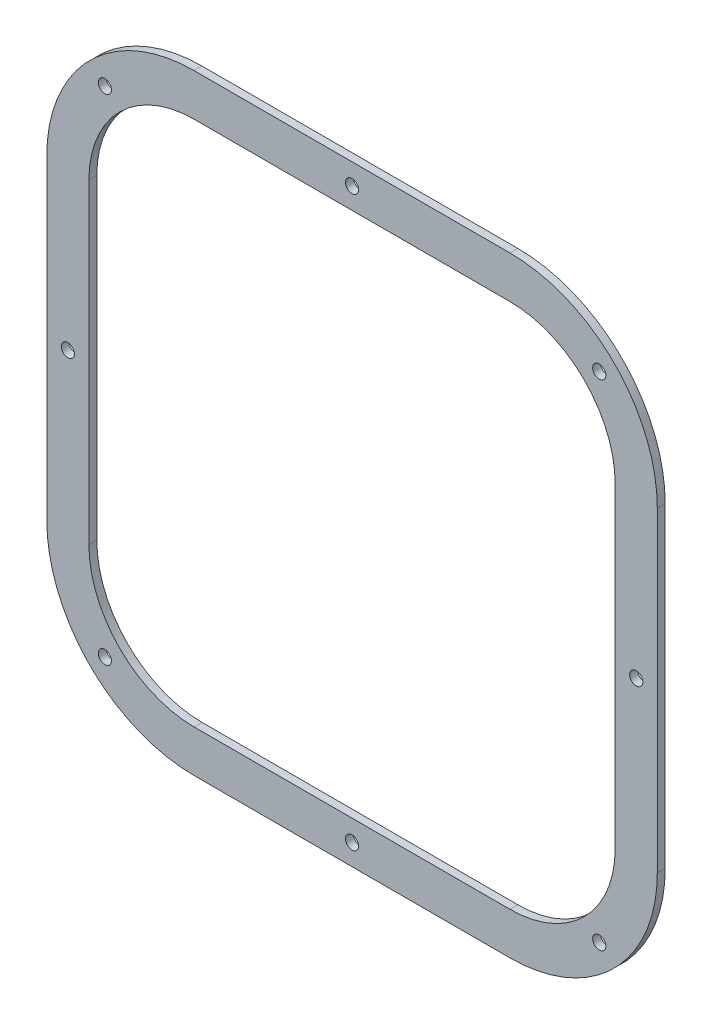
ISO-10303-21;
HEADER;
FILE_DESCRIPTION(('STEP AP214'),'2;1');
FILE_NAME('part.step','',(''),(''),'','','');
FILE_SCHEMA(('AUTOMOTIVE_DESIGN { 1 0 10303 214 1 1 1 1 }'));
ENDSEC;
DATA;
#1=APPLICATION_CONTEXT('core data for automotive mechanical design processes');
#2=APPLICATION_PROTOCOL_DEFINITION('international standard','automotive_design',2000,#1);
#3=PRODUCT_CONTEXT('',#1,'mechanical');
#4=PRODUCT('Part','Part','',(#3));
#5=PRODUCT_RELATED_PRODUCT_CATEGORY('part','',(#4));
#6=PRODUCT_DEFINITION_FORMATION('','',#4);
#7=PRODUCT_DEFINITION_CONTEXT('part definition',#1,'design');
#8=PRODUCT_DEFINITION('design','',#6,#7);
#9=PRODUCT_DEFINITION_SHAPE('','',#8);
#10=(LENGTH_UNIT() NAMED_UNIT(*) SI_UNIT(.MILLI.,.METRE.));
#11=(NAMED_UNIT(*) PLANE_ANGLE_UNIT() SI_UNIT($,.RADIAN.));
#12=(NAMED_UNIT(*) SI_UNIT($,.STERADIAN.) SOLID_ANGLE_UNIT());
#13=UNCERTAINTY_MEASURE_WITH_UNIT(LENGTH_MEASURE(1.E-05),#10,'distance_accuracy_value','');
#14=(GEOMETRIC_REPRESENTATION_CONTEXT(3) GLOBAL_UNCERTAINTY_ASSIGNED_CONTEXT((#13)) GLOBAL_UNIT_ASSIGNED_CONTEXT((#10,
#11,#12)) REPRESENTATION_CONTEXT('',''));
#15=CARTESIAN_POINT('',(0.,0.,0.));
#16=DIRECTION('',(0.,0.,1.));
#17=DIRECTION('',(1.,0.,0.));
#18=AXIS2_PLACEMENT_3D('',#15,#16,#17);
#19=CARTESIAN_POINT('',(87.9999999999999,88.,0.));
#20=DIRECTION('',(0.,0.,1.));
#21=DIRECTION('',(1.,0.,0.));
#22=AXIS2_PLACEMENT_3D('',#19,#20,#21);
#23=CYLINDRICAL_SURFACE('',#22,28.);
#24=DIRECTION('',(0.,0.,1.));
#25=VECTOR('',#24,1.);
#26=CARTESIAN_POINT('',(116.,88.,0.));
#27=LINE('',#26,#25);
#28=CARTESIAN_POINT('',(116.,88.,-1.5));
#29=VERTEX_POINT('',#28);
#30=CARTESIAN_POINT('',(116.,88.,0.));
#31=VERTEX_POINT('',#30);
#32=EDGE_CURVE('E11',#29,#31,#27,.T.);
#33=ORIENTED_EDGE('',*,*,#32,.F.);
#34=CARTESIAN_POINT('',(87.9999999999999,88.,-1.5));
#35=DIRECTION('',(0.,0.,1.));
#36=DIRECTION('',(1.,0.,0.));
#37=AXIS2_PLACEMENT_3D('',#34,#35,#36);
#38=CIRCLE('',#37,28.);
#39=CARTESIAN_POINT('',(87.9999999999997,116.,-1.5));
#40=VERTEX_POINT('',#39);
#41=EDGE_CURVE('E132',#29,#40,#38,.T.);
#42=ORIENTED_EDGE('',*,*,#41,.T.);
#43=DIRECTION('',(0.,0.,1.));
#44=VECTOR('',#43,1.);
#45=CARTESIAN_POINT('',(87.9999999999997,116.,0.));
#46=LINE('',#45,#44);
#47=CARTESIAN_POINT('',(87.9999999999997,116.,0.));
#48=VERTEX_POINT('',#47);
#49=EDGE_CURVE('E50',#40,#48,#46,.T.);
#50=ORIENTED_EDGE('',*,*,#49,.T.);
#51=CARTESIAN_POINT('',(87.9999999999999,88.,0.));
#52=DIRECTION('',(0.,0.,1.));
#53=DIRECTION('',(-1.,0.,0.));
#54=AXIS2_PLACEMENT_3D('',#51,#52,#53);
#55=CIRCLE('',#54,28.);
#56=EDGE_CURVE('E209',#31,#48,#55,.T.);
#57=ORIENTED_EDGE('',*,*,#56,.F.);
#58=EDGE_LOOP('',(#33,#42,#50,#57));
#59=FACE_BOUND('',#58,.T.);
#60=ADVANCED_FACE('F40',(#59),#23,.T.);
#61=CARTESIAN_POINT('',(28.,116.,0.));
#62=DIRECTION('',(0.,1.,0.));
#63=DIRECTION('',(-1.,0.,0.));
#64=AXIS2_PLACEMENT_3D('',#61,#62,#63);
#65=PLANE('',#64);
#66=ORIENTED_EDGE('',*,*,#49,.F.);
#67=DIRECTION('',(1.,0.,0.));
#68=VECTOR('',#67,1.);
#69=CARTESIAN_POINT('',(87.9999999999999,116.,-1.5));
#70=LINE('',#69,#68);
#71=CARTESIAN_POINT('',(28.,116.,-1.5));
#72=VERTEX_POINT('',#71);
#73=EDGE_CURVE('E163',#40,#72,#70,.F.);
#74=ORIENTED_EDGE('',*,*,#73,.T.);
#75=DIRECTION('',(0.,0.,1.));
#76=VECTOR('',#75,1.);
#77=CARTESIAN_POINT('',(28.,116.,0.));
#78=LINE('',#77,#76);
#79=CARTESIAN_POINT('',(28.,116.,0.));
#80=VERTEX_POINT('',#79);
#81=EDGE_CURVE('E202',#72,#80,#78,.T.);
#82=ORIENTED_EDGE('',*,*,#81,.T.);
#83=DIRECTION('',(-1.,0.,0.));
#84=VECTOR('',#83,1.);
#85=CARTESIAN_POINT('',(28.,116.,0.));
#86=LINE('',#85,#84);
#87=EDGE_CURVE('E218',#48,#80,#86,.T.);
#88=ORIENTED_EDGE('',*,*,#87,.F.);
#89=EDGE_LOOP('',(#66,#74,#82,#88));
#90=FACE_BOUND('',#89,.T.);
#91=ADVANCED_FACE('F222',(#90),#65,.T.);
#92=CARTESIAN_POINT('',(28.,88.,0.));
#93=DIRECTION('',(0.,0.,1.));
#94=DIRECTION('',(1.,0.,0.));
#95=AXIS2_PLACEMENT_3D('',#92,#93,#94);
#96=CYLINDRICAL_SURFACE('',#95,28.);
#97=ORIENTED_EDGE('',*,*,#81,.F.);
#98=CARTESIAN_POINT('',(28.,88.,-1.5));
#99=DIRECTION('',(0.,0.,1.));
#100=DIRECTION('',(1.,0.,0.));
#101=AXIS2_PLACEMENT_3D('',#98,#99,#100);
#102=CIRCLE('',#101,28.);
#103=CARTESIAN_POINT('',(0.,88.,-1.5));
#104=VERTEX_POINT('',#103);
#105=EDGE_CURVE('E159',#72,#104,#102,.T.);
#106=ORIENTED_EDGE('',*,*,#105,.T.);
#107=DIRECTION('',(0.,0.,1.));
#108=VECTOR('',#107,1.);
#109=CARTESIAN_POINT('',(0.,88.,0.));
#110=LINE('',#109,#108);
#111=CARTESIAN_POINT('',(0.,88.,0.));
#112=VERTEX_POINT('',#111);
#113=EDGE_CURVE('E199',#104,#112,#110,.T.);
#114=ORIENTED_EDGE('',*,*,#113,.T.);
#115=CARTESIAN_POINT('',(28.,88.,0.));
#116=DIRECTION('',(0.,0.,1.));
#117=DIRECTION('',(1.,0.,0.));
#118=AXIS2_PLACEMENT_3D('',#115,#116,#117);
#119=CIRCLE('',#118,28.);
#120=EDGE_CURVE('E224',#80,#112,#119,.T.);
#121=ORIENTED_EDGE('',*,*,#120,.F.);
#122=EDGE_LOOP('',(#97,#106,#114,#121));
#123=FACE_BOUND('',#122,.T.);
#124=ADVANCED_FACE('F326',(#123),#96,.T.);
#125=CARTESIAN_POINT('',(0.,88.,0.));
#126=DIRECTION('',(-1.,0.,0.));
#127=DIRECTION('',(0.,-1.,0.));
#128=AXIS2_PLACEMENT_3D('',#125,#126,#127);
#129=PLANE('',#128);
#130=ORIENTED_EDGE('',*,*,#113,.F.);
#131=DIRECTION('',(0.,1.,0.));
#132=VECTOR('',#131,1.);
#133=CARTESIAN_POINT('',(0.,28.,-1.5));
#134=LINE('',#133,#132);
#135=CARTESIAN_POINT('',(0.,28.0000000000002,-1.5));
#136=VERTEX_POINT('',#135);
#137=EDGE_CURVE('E155',#104,#136,#134,.F.);
#138=ORIENTED_EDGE('',*,*,#137,.T.);
#139=DIRECTION('',(0.,0.,1.));
#140=VECTOR('',#139,1.);
#141=CARTESIAN_POINT('',(0.,28.0000000000002,0.));
#142=LINE('',#141,#140);
#143=CARTESIAN_POINT('',(0.,28.0000000000002,0.));
#144=VERTEX_POINT('',#143);
#145=EDGE_CURVE('E196',#136,#144,#142,.T.);
#146=ORIENTED_EDGE('',*,*,#145,.T.);
#147=DIRECTION('',(0.,-1.,0.));
#148=VECTOR('',#147,1.);
#149=CARTESIAN_POINT('',(0.,88.,0.));
#150=LINE('',#149,#148);
#151=EDGE_CURVE('E229',#112,#144,#150,.T.);
#152=ORIENTED_EDGE('',*,*,#151,.F.);
#153=EDGE_LOOP('',(#130,#138,#146,#152));
#154=FACE_BOUND('',#153,.T.);
#155=ADVANCED_FACE('F331',(#154),#129,.T.);
#156=CARTESIAN_POINT('',(28.,28.,0.));
#157=DIRECTION('',(0.,0.,1.));
#158=DIRECTION('',(1.,0.,0.));
#159=AXIS2_PLACEMENT_3D('',#156,#157,#158);
#160=CYLINDRICAL_SURFACE('',#159,28.);
#161=ORIENTED_EDGE('',*,*,#145,.F.);
#162=CARTESIAN_POINT('',(28.,28.,-1.5));
#163=DIRECTION('',(0.,0.,1.));
#164=DIRECTION('',(1.,0.,0.));
#165=AXIS2_PLACEMENT_3D('',#162,#163,#164);
#166=CIRCLE('',#165,28.);
#167=CARTESIAN_POINT('',(28.,0.,-1.5));
#168=VERTEX_POINT('',#167);
#169=EDGE_CURVE('E151',#136,#168,#166,.T.);
#170=ORIENTED_EDGE('',*,*,#169,.T.);
#171=DIRECTION('',(0.,0.,1.));
#172=VECTOR('',#171,1.);
#173=CARTESIAN_POINT('',(28.,0.,0.));
#174=LINE('',#173,#172);
#175=CARTESIAN_POINT('',(28.,0.,0.));
#176=VERTEX_POINT('',#175);
#177=EDGE_CURVE('E194',#168,#176,#174,.T.);
#178=ORIENTED_EDGE('',*,*,#177,.T.);
#179=CARTESIAN_POINT('',(28.,28.,0.));
#180=DIRECTION('',(0.,0.,1.));
#181=DIRECTION('',(1.,0.,0.));
#182=AXIS2_PLACEMENT_3D('',#179,#180,#181);
#183=CIRCLE('',#182,28.);
#184=EDGE_CURVE('E236',#144,#176,#183,.T.);
#185=ORIENTED_EDGE('',*,*,#184,.F.);
#186=EDGE_LOOP('',(#161,#170,#178,#185));
#187=FACE_BOUND('',#186,.T.);
#188=ADVANCED_FACE('F335',(#187),#160,.T.);
#189=CARTESIAN_POINT('',(28.,0.,0.));
#190=DIRECTION('',(0.,-1.,0.));
#191=DIRECTION('',(1.,0.,0.));
#192=AXIS2_PLACEMENT_3D('',#189,#190,#191);
#193=PLANE('',#192);
#194=ORIENTED_EDGE('',*,*,#177,.F.);
#195=DIRECTION('',(1.,0.,0.));
#196=VECTOR('',#195,1.);
#197=CARTESIAN_POINT('',(87.9999999999999,0.,-1.5));
#198=LINE('',#197,#196);
#199=CARTESIAN_POINT('',(87.9999999999997,0.,-1.5));
#200=VERTEX_POINT('',#199);
#201=EDGE_CURVE('E147',#168,#200,#198,.T.);
#202=ORIENTED_EDGE('',*,*,#201,.T.);
#203=DIRECTION('',(0.,0.,1.));
#204=VECTOR('',#203,1.);
#205=CARTESIAN_POINT('',(87.9999999999997,0.,0.));
#206=LINE('',#205,#204);
#207=CARTESIAN_POINT('',(87.9999999999997,0.,0.));
#208=VERTEX_POINT('',#207);
#209=EDGE_CURVE('E58',#200,#208,#206,.T.);
#210=ORIENTED_EDGE('',*,*,#209,.T.);
#211=DIRECTION('',(1.,0.,0.));
#212=VECTOR('',#211,1.);
#213=CARTESIAN_POINT('',(28.,0.,0.));
#214=LINE('',#213,#212);
#215=EDGE_CURVE('E192',#176,#208,#214,.T.);
#216=ORIENTED_EDGE('',*,*,#215,.F.);
#217=EDGE_LOOP('',(#194,#202,#210,#216));
#218=FACE_BOUND('',#217,.T.);
#219=ADVANCED_FACE('F339',(#218),#193,.T.);
#220=CARTESIAN_POINT('',(87.9999999999999,28.,0.));
#221=DIRECTION('',(0.,0.,1.));
#222=DIRECTION('',(1.,0.,0.));
#223=AXIS2_PLACEMENT_3D('',#220,#221,#222);
#224=CYLINDRICAL_SURFACE('',#223,28.);
#225=ORIENTED_EDGE('',*,*,#209,.F.);
#226=CARTESIAN_POINT('',(87.9999999999999,28.,-1.5));
#227=DIRECTION('',(0.,0.,1.));
#228=DIRECTION('',(1.,0.,0.));
#229=AXIS2_PLACEMENT_3D('',#226,#227,#228);
#230=CIRCLE('',#229,28.);
#231=CARTESIAN_POINT('',(116.,28.,-1.5));
#232=VERTEX_POINT('',#231);
#233=EDGE_CURVE('E130',#200,#232,#230,.T.);
#234=ORIENTED_EDGE('',*,*,#233,.T.);
#235=DIRECTION('',(0.,0.,1.));
#236=VECTOR('',#235,1.);
#237=CARTESIAN_POINT('',(116.,28.,0.));
#238=LINE('',#237,#236);
#239=CARTESIAN_POINT('',(116.,28.,0.));
#240=VERTEX_POINT('',#239);
#241=EDGE_CURVE('E44',#232,#240,#238,.T.);
#242=ORIENTED_EDGE('',*,*,#241,.T.);
#243=CARTESIAN_POINT('',(87.9999999999999,28.,0.));
#244=DIRECTION('',(0.,0.,1.));
#245=DIRECTION('',(1.,0.,0.));
#246=AXIS2_PLACEMENT_3D('',#243,#244,#245);
#247=CIRCLE('',#246,28.);
#248=EDGE_CURVE('E496',#208,#240,#247,.T.);
#249=ORIENTED_EDGE('',*,*,#248,.F.);
#250=EDGE_LOOP('',(#225,#234,#242,#249));
#251=FACE_BOUND('',#250,.T.);
#252=ADVANCED_FACE('F135',(#251),#224,.T.);
#253=CARTESIAN_POINT('',(87.9999999999999,28.,0.));
#254=DIRECTION('',(0.,0.,1.));
#255=DIRECTION('',(1.,0.,0.));
#256=AXIS2_PLACEMENT_3D('',#253,#254,#255);
#257=CYLINDRICAL_SURFACE('',#256,20.);
#258=DIRECTION('',(0.,0.,1.));
#259=VECTOR('',#258,1.);
#260=CARTESIAN_POINT('',(108.,28.,0.));
#261=LINE('',#260,#259);
#262=CARTESIAN_POINT('',(108.,28.,-1.5));
#263=VERTEX_POINT('',#262);
#264=CARTESIAN_POINT('',(108.,28.,0.));
#265=VERTEX_POINT('',#264);
#266=EDGE_CURVE('E125',#263,#265,#261,.T.);
#267=ORIENTED_EDGE('',*,*,#266,.F.);
#268=CARTESIAN_POINT('',(87.9999999999999,28.,-1.5));
#269=DIRECTION('',(0.,0.,1.));
#270=DIRECTION('',(1.,0.,0.));
#271=AXIS2_PLACEMENT_3D('',#268,#269,#270);
#272=CIRCLE('',#271,20.);
#273=CARTESIAN_POINT('',(87.9999999999997,8.00000000000001,-1.5));
#274=VERTEX_POINT('',#273);
#275=EDGE_CURVE('E269',#274,#263,#272,.T.);
#276=ORIENTED_EDGE('',*,*,#275,.F.);
#277=DIRECTION('',(0.,0.,1.));
#278=VECTOR('',#277,1.);
#279=CARTESIAN_POINT('',(87.9999999999997,8.00000000000001,0.));
#280=LINE('',#279,#278);
#281=CARTESIAN_POINT('',(87.9999999999997,8.00000000000001,0.));
#282=VERTEX_POINT('',#281);
#283=EDGE_CURVE('E185',#274,#282,#280,.T.);
#284=ORIENTED_EDGE('',*,*,#283,.T.);
#285=CARTESIAN_POINT('',(87.9999999999999,28.,0.));
#286=DIRECTION('',(0.,0.,1.));
#287=DIRECTION('',(1.,0.,0.));
#288=AXIS2_PLACEMENT_3D('',#285,#286,#287);
#289=CIRCLE('',#288,20.);
#290=EDGE_CURVE('E436',#282,#265,#289,.T.);
#291=ORIENTED_EDGE('',*,*,#290,.T.);
#292=EDGE_LOOP('',(#267,#276,#284,#291));
#293=FACE_BOUND('',#292,.T.);
#294=ADVANCED_FACE('F344',(#293),#257,.F.);
#295=CARTESIAN_POINT('',(28.,8.00000000000001,0.));
#296=DIRECTION('',(0.,-1.,0.));
#297=DIRECTION('',(1.,0.,0.));
#298=AXIS2_PLACEMENT_3D('',#295,#296,#297);
#299=PLANE('',#298);
#300=ORIENTED_EDGE('',*,*,#283,.F.);
#301=DIRECTION('',(1.,0.,0.));
#302=VECTOR('',#301,1.);
#303=CARTESIAN_POINT('',(87.9999999999999,8.00000000000001,-1.5));
#304=LINE('',#303,#302);
#305=CARTESIAN_POINT('',(28.,8.00000000000001,-1.5));
#306=VERTEX_POINT('',#305);
#307=EDGE_CURVE('E265',#306,#274,#304,.T.);
#308=ORIENTED_EDGE('',*,*,#307,.F.);
#309=DIRECTION('',(0.,0.,1.));
#310=VECTOR('',#309,1.);
#311=CARTESIAN_POINT('',(28.,8.00000000000001,0.));
#312=LINE('',#311,#310);
#313=CARTESIAN_POINT('',(28.,8.00000000000001,0.));
#314=VERTEX_POINT('',#313);
#315=EDGE_CURVE('E182',#306,#314,#312,.T.);
#316=ORIENTED_EDGE('',*,*,#315,.T.);
#317=DIRECTION('',(1.,0.,0.));
#318=VECTOR('',#317,1.);
#319=CARTESIAN_POINT('',(28.,8.00000000000001,0.));
#320=LINE('',#319,#318);
#321=EDGE_CURVE('E432',#314,#282,#320,.T.);
#322=ORIENTED_EDGE('',*,*,#321,.T.);
#323=EDGE_LOOP('',(#300,#308,#316,#322));
#324=FACE_BOUND('',#323,.T.);
#325=ADVANCED_FACE('F348',(#324),#299,.F.);
#326=CARTESIAN_POINT('',(28.,28.,0.));
#327=DIRECTION('',(0.,0.,1.));
#328=DIRECTION('',(1.,0.,0.));
#329=AXIS2_PLACEMENT_3D('',#326,#327,#328);
#330=CYLINDRICAL_SURFACE('',#329,20.);
#331=ORIENTED_EDGE('',*,*,#315,.F.);
#332=CARTESIAN_POINT('',(28.,28.,-1.5));
#333=DIRECTION('',(0.,0.,1.));
#334=DIRECTION('',(1.,0.,0.));
#335=AXIS2_PLACEMENT_3D('',#332,#333,#334);
#336=CIRCLE('',#335,20.);
#337=CARTESIAN_POINT('',(8.00000000000001,28.0000000000001,-1.5));
#338=VERTEX_POINT('',#337);
#339=EDGE_CURVE('E261',#338,#306,#336,.T.);
#340=ORIENTED_EDGE('',*,*,#339,.F.);
#341=DIRECTION('',(0.,0.,1.));
#342=VECTOR('',#341,1.);
#343=CARTESIAN_POINT('',(8.00000000000001,28.0000000000001,0.));
#344=LINE('',#343,#342);
#345=CARTESIAN_POINT('',(8.00000000000001,28.0000000000001,0.));
#346=VERTEX_POINT('',#345);
#347=EDGE_CURVE('E179',#338,#346,#344,.T.);
#348=ORIENTED_EDGE('',*,*,#347,.T.);
#349=CARTESIAN_POINT('',(28.,28.,0.));
#350=DIRECTION('',(0.,0.,1.));
#351=DIRECTION('',(1.,0.,0.));
#352=AXIS2_PLACEMENT_3D('',#349,#350,#351);
#353=CIRCLE('',#352,20.);
#354=EDGE_CURVE('E425',#346,#314,#353,.T.);
#355=ORIENTED_EDGE('',*,*,#354,.T.);
#356=EDGE_LOOP('',(#331,#340,#348,#355));
#357=FACE_BOUND('',#356,.T.);
#358=ADVANCED_FACE('F354',(#357),#330,.F.);
#359=CARTESIAN_POINT('',(8.00000000000001,88.,0.));
#360=DIRECTION('',(-1.,0.,0.));
#361=DIRECTION('',(0.,-1.,0.));
#362=AXIS2_PLACEMENT_3D('',#359,#360,#361);
#363=PLANE('',#362);
#364=ORIENTED_EDGE('',*,*,#347,.F.);
#365=DIRECTION('',(0.,1.,0.));
#366=VECTOR('',#365,1.);
#367=CARTESIAN_POINT('',(8.00000000000001,28.,-1.5));
#368=LINE('',#367,#366);
#369=CARTESIAN_POINT('',(8.00000000000001,88.,-1.5));
#370=VERTEX_POINT('',#369);
#371=EDGE_CURVE('E257',#370,#338,#368,.F.);
#372=ORIENTED_EDGE('',*,*,#371,.F.);
#373=DIRECTION('',(0.,0.,1.));
#374=VECTOR('',#373,1.);
#375=CARTESIAN_POINT('',(8.00000000000001,88.,0.));
#376=LINE('',#375,#374);
#377=CARTESIAN_POINT('',(8.00000000000001,88.,0.));
#378=VERTEX_POINT('',#377);
#379=EDGE_CURVE('E176',#370,#378,#376,.T.);
#380=ORIENTED_EDGE('',*,*,#379,.T.);
#381=DIRECTION('',(0.,-1.,0.));
#382=VECTOR('',#381,1.);
#383=CARTESIAN_POINT('',(8.00000000000001,88.,0.));
#384=LINE('',#383,#382);
#385=EDGE_CURVE('E455',#378,#346,#384,.T.);
#386=ORIENTED_EDGE('',*,*,#385,.T.);
#387=EDGE_LOOP('',(#364,#372,#380,#386));
#388=FACE_BOUND('',#387,.T.);
#389=ADVANCED_FACE('F413',(#388),#363,.F.);
#390=CARTESIAN_POINT('',(28.,88.,0.));
#391=DIRECTION('',(0.,0.,1.));
#392=DIRECTION('',(1.,0.,0.));
#393=AXIS2_PLACEMENT_3D('',#390,#391,#392);
#394=CYLINDRICAL_SURFACE('',#393,20.);
#395=ORIENTED_EDGE('',*,*,#379,.F.);
#396=CARTESIAN_POINT('',(28.,88.,-1.5));
#397=DIRECTION('',(0.,0.,1.));
#398=DIRECTION('',(1.,0.,0.));
#399=AXIS2_PLACEMENT_3D('',#396,#397,#398);
#400=CIRCLE('',#399,20.);
#401=CARTESIAN_POINT('',(28.0000000000001,108.,-1.5));
#402=VERTEX_POINT('',#401);
#403=EDGE_CURVE('E253',#402,#370,#400,.T.);
#404=ORIENTED_EDGE('',*,*,#403,.F.);
#405=DIRECTION('',(0.,0.,1.));
#406=VECTOR('',#405,1.);
#407=CARTESIAN_POINT('',(28.0000000000001,108.,0.));
#408=LINE('',#407,#406);
#409=CARTESIAN_POINT('',(28.0000000000001,108.,0.));
#410=VERTEX_POINT('',#409);
#411=EDGE_CURVE('E172',#402,#410,#408,.T.);
#412=ORIENTED_EDGE('',*,*,#411,.T.);
#413=CARTESIAN_POINT('',(28.,88.,0.));
#414=DIRECTION('',(0.,0.,1.));
#415=DIRECTION('',(1.,0.,0.));
#416=AXIS2_PLACEMENT_3D('',#413,#414,#415);
#417=CIRCLE('',#416,20.);
#418=EDGE_CURVE('E459',#410,#378,#417,.T.);
#419=ORIENTED_EDGE('',*,*,#418,.T.);
#420=EDGE_LOOP('',(#395,#404,#412,#419));
#421=FACE_BOUND('',#420,.T.);
#422=ADVANCED_FACE('F409',(#421),#394,.F.);
#423=CARTESIAN_POINT('',(28.0000000000001,108.,0.));
#424=DIRECTION('',(0.,1.,0.));
#425=DIRECTION('',(-1.,0.,0.));
#426=AXIS2_PLACEMENT_3D('',#423,#424,#425);
#427=PLANE('',#426);
#428=ORIENTED_EDGE('',*,*,#411,.F.);
#429=DIRECTION('',(1.,0.,0.));
#430=VECTOR('',#429,1.);
#431=CARTESIAN_POINT('',(87.9999999999999,108.,-1.5));
#432=LINE('',#431,#430);
#433=CARTESIAN_POINT('',(87.9999999999997,108.,-1.5));
#434=VERTEX_POINT('',#433);
#435=EDGE_CURVE('E248',#434,#402,#432,.F.);
#436=ORIENTED_EDGE('',*,*,#435,.F.);
#437=DIRECTION('',(0.,0.,1.));
#438=VECTOR('',#437,1.);
#439=CARTESIAN_POINT('',(87.9999999999997,108.,0.));
#440=LINE('',#439,#438);
#441=CARTESIAN_POINT('',(87.9999999999997,108.,0.));
#442=VERTEX_POINT('',#441);
#443=EDGE_CURVE('E169',#434,#442,#440,.T.);
#444=ORIENTED_EDGE('',*,*,#443,.T.);
#445=DIRECTION('',(-1.,0.,0.));
#446=VECTOR('',#445,1.);
#447=CARTESIAN_POINT('',(28.0000000000001,108.,0.));
#448=LINE('',#447,#446);
#449=EDGE_CURVE('E463',#442,#410,#448,.T.);
#450=ORIENTED_EDGE('',*,*,#449,.T.);
#451=EDGE_LOOP('',(#428,#436,#444,#450));
#452=FACE_BOUND('',#451,.T.);
#453=ADVANCED_FACE('F405',(#452),#427,.F.);
#454=CARTESIAN_POINT('',(87.9999999999999,88.,0.));
#455=DIRECTION('',(0.,0.,1.));
#456=DIRECTION('',(1.,0.,0.));
#457=AXIS2_PLACEMENT_3D('',#454,#455,#456);
#458=CYLINDRICAL_SURFACE('',#457,20.);
#459=ORIENTED_EDGE('',*,*,#443,.F.);
#460=CARTESIAN_POINT('',(87.9999999999999,88.,-1.5));
#461=DIRECTION('',(0.,0.,1.));
#462=DIRECTION('',(1.,0.,0.));
#463=AXIS2_PLACEMENT_3D('',#460,#461,#462);
#464=CIRCLE('',#463,20.);
#465=CARTESIAN_POINT('',(108.,88.,-1.5));
#466=VERTEX_POINT('',#465);
#467=EDGE_CURVE('E243',#466,#434,#464,.T.);
#468=ORIENTED_EDGE('',*,*,#467,.F.);
#469=DIRECTION('',(0.,0.,1.));
#470=VECTOR('',#469,1.);
#471=CARTESIAN_POINT('',(108.,88.,0.));
#472=LINE('',#471,#470);
#473=CARTESIAN_POINT('',(108.,88.,0.));
#474=VERTEX_POINT('',#473);
#475=EDGE_CURVE('E173',#466,#474,#472,.T.);
#476=ORIENTED_EDGE('',*,*,#475,.T.);
#477=CARTESIAN_POINT('',(87.9999999999999,88.,0.));
#478=DIRECTION('',(0.,0.,1.));
#479=DIRECTION('',(-1.,0.,0.));
#480=AXIS2_PLACEMENT_3D('',#477,#478,#479);
#481=CIRCLE('',#480,20.);
#482=EDGE_CURVE('E150',#474,#442,#481,.T.);
#483=ORIENTED_EDGE('',*,*,#482,.T.);
#484=EDGE_LOOP('',(#459,#468,#476,#483));
#485=FACE_BOUND('',#484,.T.);
#486=ADVANCED_FACE('F363',(#485),#458,.F.);
#487=CARTESIAN_POINT('',(108.,88.,0.));
#488=DIRECTION('',(1.,0.,0.));
#489=DIRECTION('',(0.,1.,0.));
#490=AXIS2_PLACEMENT_3D('',#487,#488,#489);
#491=PLANE('',#490);
#492=DIRECTION('',(0.,1.,0.));
#493=VECTOR('',#492,1.);
#494=CARTESIAN_POINT('',(108.,28.,-1.5));
#495=LINE('',#494,#493);
#496=EDGE_CURVE('E247',#263,#466,#495,.T.);
#497=ORIENTED_EDGE('',*,*,#496,.F.);
#498=ORIENTED_EDGE('',*,*,#266,.T.);
#499=DIRECTION('',(0.,1.,0.));
#500=VECTOR('',#499,1.);
#501=CARTESIAN_POINT('',(108.,88.,0.));
#502=LINE('',#501,#500);
#503=EDGE_CURVE('E442',#265,#474,#502,.T.);
#504=ORIENTED_EDGE('',*,*,#503,.T.);
#505=ORIENTED_EDGE('',*,*,#475,.F.);
#506=EDGE_LOOP('',(#497,#498,#504,#505));
#507=FACE_BOUND('',#506,.T.);
#508=ADVANCED_FACE('F359',(#507),#491,.F.);
#509=CARTESIAN_POINT('',(4.,58.,0.));
#510=DIRECTION('',(0.,0.,1.));
#511=DIRECTION('',(1.,0.,0.));
#512=AXIS2_PLACEMENT_3D('',#509,#510,#511);
#513=CYLINDRICAL_SURFACE('',#512,1.25);
#514=CARTESIAN_POINT('',(4.,58.,0.));
#515=DIRECTION('',(0.,0.,1.));
#516=DIRECTION('',(1.,0.,0.));
#517=AXIS2_PLACEMENT_3D('',#514,#515,#516);
#518=CIRCLE('',#517,1.25);
#519=CARTESIAN_POINT('',(5.25,58.,0.));
#520=VERTEX_POINT('',#519);
#521=EDGE_CURVE('E467',#520,#520,#518,.T.);
#522=ORIENTED_EDGE('',*,*,#521,.T.);
#523=EDGE_LOOP('',(#522));
#524=FACE_BOUND('',#523,.T.);
#525=CARTESIAN_POINT('',(4.,58.,-1.5));
#526=DIRECTION('',(0.,0.,1.));
#527=DIRECTION('',(1.,0.,0.));
#528=AXIS2_PLACEMENT_3D('',#525,#526,#527);
#529=CIRCLE('',#528,1.25);
#530=CARTESIAN_POINT('',(5.25,58.,-1.5));
#531=VERTEX_POINT('',#530);
#532=EDGE_CURVE('E252',#531,#531,#529,.T.);
#533=ORIENTED_EDGE('',*,*,#532,.F.);
#534=EDGE_LOOP('',(#533));
#535=FACE_BOUND('',#534,.T.);
#536=ADVANCED_FACE('F362',(#524,#535),#513,.F.);
#537=CARTESIAN_POINT('',(57.9999999999999,112.,0.));
#538=DIRECTION('',(0.,0.,1.));
#539=DIRECTION('',(1.,0.,0.));
#540=AXIS2_PLACEMENT_3D('',#537,#538,#539);
#541=CYLINDRICAL_SURFACE('',#540,1.25);
#542=CARTESIAN_POINT('',(57.9999999999999,112.,0.));
#543=DIRECTION('',(0.,0.,1.));
#544=DIRECTION('',(1.,0.,0.));
#545=AXIS2_PLACEMENT_3D('',#542,#543,#544);
#546=CIRCLE('',#545,1.25);
#547=CARTESIAN_POINT('',(59.2499999999999,112.,0.));
#548=VERTEX_POINT('',#547);
#549=EDGE_CURVE('E471',#548,#548,#546,.T.);
#550=ORIENTED_EDGE('',*,*,#549,.T.);
#551=EDGE_LOOP('',(#550));
#552=FACE_BOUND('',#551,.T.);
#553=CARTESIAN_POINT('',(57.9999999999999,112.,-1.5));
#554=DIRECTION('',(0.,0.,1.));
#555=DIRECTION('',(1.,0.,0.));
#556=AXIS2_PLACEMENT_3D('',#553,#554,#555);
#557=CIRCLE('',#556,1.25);
#558=CARTESIAN_POINT('',(59.2499999999999,112.,-1.5));
#559=VERTEX_POINT('',#558);
#560=EDGE_CURVE('E279',#559,#559,#557,.T.);
#561=ORIENTED_EDGE('',*,*,#560,.F.);
#562=EDGE_LOOP('',(#561));
#563=FACE_BOUND('',#562,.T.);
#564=ADVANCED_FACE('F367',(#552,#563),#541,.F.);
#565=CARTESIAN_POINT('',(112.,58.,0.));
#566=DIRECTION('',(0.,0.,1.));
#567=DIRECTION('',(1.,0.,0.));
#568=AXIS2_PLACEMENT_3D('',#565,#566,#567);
#569=CYLINDRICAL_SURFACE('',#568,1.25);
#570=CARTESIAN_POINT('',(112.,58.,0.));
#571=DIRECTION('',(0.,0.,1.));
#572=DIRECTION('',(1.,0.,0.));
#573=AXIS2_PLACEMENT_3D('',#570,#571,#572);
#574=CIRCLE('',#573,1.25);
#575=CARTESIAN_POINT('',(113.25,58.,0.));
#576=VERTEX_POINT('',#575);
#577=EDGE_CURVE('E475',#576,#576,#574,.T.);
#578=ORIENTED_EDGE('',*,*,#577,.T.);
#579=EDGE_LOOP('',(#578));
#580=FACE_BOUND('',#579,.T.);
#581=CARTESIAN_POINT('',(112.,58.,-1.5));
#582=DIRECTION('',(0.,0.,1.));
#583=DIRECTION('',(1.,0.,0.));
#584=AXIS2_PLACEMENT_3D('',#581,#582,#583);
#585=CIRCLE('',#584,1.25);
#586=CARTESIAN_POINT('',(113.25,58.,-1.5));
#587=VERTEX_POINT('',#586);
#588=EDGE_CURVE('E283',#587,#587,#585,.T.);
#589=ORIENTED_EDGE('',*,*,#588,.F.);
#590=EDGE_LOOP('',(#589));
#591=FACE_BOUND('',#590,.T.);
#592=ADVANCED_FACE('F371',(#580,#591),#569,.F.);
#593=CARTESIAN_POINT('',(57.9999999999999,4.,0.));
#594=DIRECTION('',(0.,0.,1.));
#595=DIRECTION('',(1.,0.,0.));
#596=AXIS2_PLACEMENT_3D('',#593,#594,#595);
#597=CYLINDRICAL_SURFACE('',#596,1.25);
#598=CARTESIAN_POINT('',(57.9999999999999,4.,0.));
#599=DIRECTION('',(0.,0.,1.));
#600=DIRECTION('',(1.,0.,0.));
#601=AXIS2_PLACEMENT_3D('',#598,#599,#600);
#602=CIRCLE('',#601,1.25);
#603=CARTESIAN_POINT('',(59.2499999999999,4.,0.));
#604=VERTEX_POINT('',#603);
#605=EDGE_CURVE('E479',#604,#604,#602,.T.);
#606=ORIENTED_EDGE('',*,*,#605,.T.);
#607=EDGE_LOOP('',(#606));
#608=FACE_BOUND('',#607,.T.);
#609=CARTESIAN_POINT('',(57.9999999999999,4.,-1.5));
#610=DIRECTION('',(0.,0.,1.));
#611=DIRECTION('',(1.,0.,0.));
#612=AXIS2_PLACEMENT_3D('',#609,#610,#611);
#613=CIRCLE('',#612,1.25);
#614=CARTESIAN_POINT('',(59.2499999999999,4.,-1.5));
#615=VERTEX_POINT('',#614);
#616=EDGE_CURVE('E287',#615,#615,#613,.T.);
#617=ORIENTED_EDGE('',*,*,#616,.F.);
#618=EDGE_LOOP('',(#617));
#619=FACE_BOUND('',#618,.T.);
#620=ADVANCED_FACE('F375',(#608,#619),#597,.F.);
#621=CARTESIAN_POINT('',(104.970562748477,104.970562748477,0.));
#622=DIRECTION('',(0.,0.,1.));
#623=DIRECTION('',(1.,0.,0.));
#624=AXIS2_PLACEMENT_3D('',#621,#622,#623);
#625=CYLINDRICAL_SURFACE('',#624,1.25);
#626=CARTESIAN_POINT('',(104.970562748477,104.970562748477,0.));
#627=DIRECTION('',(0.,0.,1.));
#628=DIRECTION('',(1.,0.,0.));
#629=AXIS2_PLACEMENT_3D('',#626,#627,#628);
#630=CIRCLE('',#629,1.25);
#631=CARTESIAN_POINT('',(106.220562748477,104.970562748477,0.));
#632=VERTEX_POINT('',#631);
#633=EDGE_CURVE('E387',#632,#632,#630,.T.);
#634=ORIENTED_EDGE('',*,*,#633,.T.);
#635=EDGE_LOOP('',(#634));
#636=FACE_BOUND('',#635,.T.);
#637=CARTESIAN_POINT('',(104.970562748477,104.970562748477,-1.5));
#638=DIRECTION('',(0.,0.,1.));
#639=DIRECTION('',(1.,0.,0.));
#640=AXIS2_PLACEMENT_3D('',#637,#638,#639);
#641=CIRCLE('',#640,1.25);
#642=CARTESIAN_POINT('',(106.220562748477,104.970562748477,-1.5));
#643=VERTEX_POINT('',#642);
#644=EDGE_CURVE('E291',#643,#643,#641,.T.);
#645=ORIENTED_EDGE('',*,*,#644,.F.);
#646=EDGE_LOOP('',(#645));
#647=FACE_BOUND('',#646,.T.);
#648=ADVANCED_FACE('F318',(#636,#647),#625,.F.);
#649=CARTESIAN_POINT('',(11.0294372515229,104.970562748477,0.));
#650=DIRECTION('',(0.,0.,1.));
#651=DIRECTION('',(1.,0.,0.));
#652=AXIS2_PLACEMENT_3D('',#649,#650,#651);
#653=CYLINDRICAL_SURFACE('',#652,1.25);
#654=CARTESIAN_POINT('',(11.0294372515229,104.970562748477,0.));
#655=DIRECTION('',(0.,0.,1.));
#656=DIRECTION('',(1.,0.,0.));
#657=AXIS2_PLACEMENT_3D('',#654,#655,#656);
#658=CIRCLE('',#657,1.25);
#659=CARTESIAN_POINT('',(12.2794372515229,104.970562748477,0.));
#660=VERTEX_POINT('',#659);
#661=EDGE_CURVE('E485',#660,#660,#658,.T.);
#662=ORIENTED_EDGE('',*,*,#661,.T.);
#663=EDGE_LOOP('',(#662));
#664=FACE_BOUND('',#663,.T.);
#665=CARTESIAN_POINT('',(11.0294372515229,104.970562748477,-1.5));
#666=DIRECTION('',(0.,0.,1.));
#667=DIRECTION('',(1.,0.,0.));
#668=AXIS2_PLACEMENT_3D('',#665,#666,#667);
#669=CIRCLE('',#668,1.25);
#670=CARTESIAN_POINT('',(12.2794372515229,104.970562748477,-1.5));
#671=VERTEX_POINT('',#670);
#672=EDGE_CURVE('E295',#671,#671,#669,.T.);
#673=ORIENTED_EDGE('',*,*,#672,.F.);
#674=EDGE_LOOP('',(#673));
#675=FACE_BOUND('',#674,.T.);
#676=ADVANCED_FACE('F309',(#664,#675),#653,.F.);
#677=CARTESIAN_POINT('',(11.0294372515229,11.0294372515229,0.));
#678=DIRECTION('',(0.,0.,1.));
#679=DIRECTION('',(1.,0.,0.));
#680=AXIS2_PLACEMENT_3D('',#677,#678,#679);
#681=CYLINDRICAL_SURFACE('',#680,1.25);
#682=CARTESIAN_POINT('',(11.0294372515229,11.0294372515229,0.));
#683=DIRECTION('',(0.,0.,1.));
#684=DIRECTION('',(1.,0.,0.));
#685=AXIS2_PLACEMENT_3D('',#682,#683,#684);
#686=CIRCLE('',#685,1.25);
#687=CARTESIAN_POINT('',(12.2794372515229,11.0294372515229,0.));
#688=VERTEX_POINT('',#687);
#689=EDGE_CURVE('E489',#688,#688,#686,.T.);
#690=ORIENTED_EDGE('',*,*,#689,.T.);
#691=EDGE_LOOP('',(#690));
#692=FACE_BOUND('',#691,.T.);
#693=CARTESIAN_POINT('',(11.0294372515229,11.0294372515229,-1.5));
#694=DIRECTION('',(0.,0.,1.));
#695=DIRECTION('',(1.,0.,0.));
#696=AXIS2_PLACEMENT_3D('',#693,#694,#695);
#697=CIRCLE('',#696,1.25);
#698=CARTESIAN_POINT('',(12.2794372515229,11.0294372515229,-1.5));
#699=VERTEX_POINT('',#698);
#700=EDGE_CURVE('E143',#699,#699,#697,.T.);
#701=ORIENTED_EDGE('',*,*,#700,.F.);
#702=EDGE_LOOP('',(#701));
#703=FACE_BOUND('',#702,.T.);
#704=ADVANCED_FACE('F306',(#692,#703),#681,.F.);
#705=CARTESIAN_POINT('',(104.970562748477,11.0294372515228,0.));
#706=DIRECTION('',(0.,0.,1.));
#707=DIRECTION('',(1.,0.,0.));
#708=AXIS2_PLACEMENT_3D('',#705,#706,#707);
#709=CYLINDRICAL_SURFACE('',#708,1.25);
#710=CARTESIAN_POINT('',(104.970562748477,11.0294372515228,0.));
#711=DIRECTION('',(0.,0.,1.));
#712=DIRECTION('',(1.,0.,0.));
#713=AXIS2_PLACEMENT_3D('',#710,#711,#712);
#714=CIRCLE('',#713,1.25);
#715=CARTESIAN_POINT('',(106.220562748477,11.0294372515228,0.));
#716=VERTEX_POINT('',#715);
#717=EDGE_CURVE('E492',#716,#716,#714,.T.);
#718=ORIENTED_EDGE('',*,*,#717,.T.);
#719=EDGE_LOOP('',(#718));
#720=FACE_BOUND('',#719,.T.);
#721=CARTESIAN_POINT('',(104.970562748477,11.0294372515228,-1.5));
#722=DIRECTION('',(0.,0.,1.));
#723=DIRECTION('',(1.,0.,0.));
#724=AXIS2_PLACEMENT_3D('',#721,#722,#723);
#725=CIRCLE('',#724,1.25);
#726=CARTESIAN_POINT('',(106.220562748477,11.0294372515228,-1.5));
#727=VERTEX_POINT('',#726);
#728=EDGE_CURVE('E137',#727,#727,#725,.T.);
#729=ORIENTED_EDGE('',*,*,#728,.F.);
#730=EDGE_LOOP('',(#729));
#731=FACE_BOUND('',#730,.T.);
#732=ADVANCED_FACE('F308',(#720,#731),#709,.F.);
#733=CARTESIAN_POINT('',(116.,88.,0.));
#734=DIRECTION('',(1.,0.,0.));
#735=DIRECTION('',(0.,1.,0.));
#736=AXIS2_PLACEMENT_3D('',#733,#734,#735);
#737=PLANE('',#736);
#738=DIRECTION('',(0.,1.,0.));
#739=VECTOR('',#738,1.);
#740=CARTESIAN_POINT('',(116.,28.,-1.5));
#741=LINE('',#740,#739);
#742=EDGE_CURVE('E118',#232,#29,#741,.T.);
#743=ORIENTED_EDGE('',*,*,#742,.T.);
#744=ORIENTED_EDGE('',*,*,#32,.T.);
#745=DIRECTION('',(0.,1.,0.));
#746=VECTOR('',#745,1.);
#747=CARTESIAN_POINT('',(116.,88.,0.));
#748=LINE('',#747,#746);
#749=EDGE_CURVE('E121',#240,#31,#748,.T.);
#750=ORIENTED_EDGE('',*,*,#749,.F.);
#751=ORIENTED_EDGE('',*,*,#241,.F.);
#752=EDGE_LOOP('',(#743,#744,#750,#751));
#753=FACE_BOUND('',#752,.T.);
#754=ADVANCED_FACE('F42',(#753),#737,.T.);
#755=CARTESIAN_POINT('',(87.9999999999999,28.,0.));
#756=DIRECTION('',(0.,0.,1.));
#757=DIRECTION('',(1.,0.,0.));
#758=AXIS2_PLACEMENT_3D('',#755,#756,#757);
#759=PLANE('',#758);
#760=ORIENTED_EDGE('',*,*,#482,.F.);
#761=ORIENTED_EDGE('',*,*,#503,.F.);
#762=ORIENTED_EDGE('',*,*,#290,.F.);
#763=ORIENTED_EDGE('',*,*,#321,.F.);
#764=ORIENTED_EDGE('',*,*,#354,.F.);
#765=ORIENTED_EDGE('',*,*,#385,.F.);
#766=ORIENTED_EDGE('',*,*,#418,.F.);
#767=ORIENTED_EDGE('',*,*,#449,.F.);
#768=EDGE_LOOP('',(#760,#761,#762,#763,#764,#765,#766,#767));
#769=FACE_BOUND('',#768,.T.);
#770=ORIENTED_EDGE('',*,*,#521,.F.);
#771=EDGE_LOOP('',(#770));
#772=FACE_BOUND('',#771,.T.);
#773=ORIENTED_EDGE('',*,*,#549,.F.);
#774=EDGE_LOOP('',(#773));
#775=FACE_BOUND('',#774,.T.);
#776=ORIENTED_EDGE('',*,*,#577,.F.);
#777=EDGE_LOOP('',(#776));
#778=FACE_BOUND('',#777,.T.);
#779=ORIENTED_EDGE('',*,*,#605,.F.);
#780=EDGE_LOOP('',(#779));
#781=FACE_BOUND('',#780,.T.);
#782=ORIENTED_EDGE('',*,*,#633,.F.);
#783=EDGE_LOOP('',(#782));
#784=FACE_BOUND('',#783,.T.);
#785=ORIENTED_EDGE('',*,*,#661,.F.);
#786=EDGE_LOOP('',(#785));
#787=FACE_BOUND('',#786,.T.);
#788=ORIENTED_EDGE('',*,*,#689,.F.);
#789=EDGE_LOOP('',(#788));
#790=FACE_BOUND('',#789,.T.);
#791=ORIENTED_EDGE('',*,*,#717,.F.);
#792=EDGE_LOOP('',(#791));
#793=FACE_BOUND('',#792,.T.);
#794=ORIENTED_EDGE('',*,*,#248,.T.);
#795=ORIENTED_EDGE('',*,*,#749,.T.);
#796=ORIENTED_EDGE('',*,*,#56,.T.);
#797=ORIENTED_EDGE('',*,*,#87,.T.);
#798=ORIENTED_EDGE('',*,*,#120,.T.);
#799=ORIENTED_EDGE('',*,*,#151,.T.);
#800=ORIENTED_EDGE('',*,*,#184,.T.);
#801=ORIENTED_EDGE('',*,*,#215,.T.);
#802=EDGE_LOOP('',(#794,#795,#796,#797,#798,#799,#800,#801));
#803=FACE_BOUND('',#802,.T.);
#804=ADVANCED_FACE('F216',(#769,#772,#775,#778,#781,#784,#787,#790,#793,#803),#759,.T.);
#805=CARTESIAN_POINT('',(87.9999999999999,28.,-1.5));
#806=DIRECTION('',(0.,0.,1.));
#807=DIRECTION('',(1.,0.,0.));
#808=AXIS2_PLACEMENT_3D('',#805,#806,#807);
#809=PLANE('',#808);
#810=ORIENTED_EDGE('',*,*,#467,.T.);
#811=ORIENTED_EDGE('',*,*,#435,.T.);
#812=ORIENTED_EDGE('',*,*,#403,.T.);
#813=ORIENTED_EDGE('',*,*,#371,.T.);
#814=ORIENTED_EDGE('',*,*,#339,.T.);
#815=ORIENTED_EDGE('',*,*,#307,.T.);
#816=ORIENTED_EDGE('',*,*,#275,.T.);
#817=ORIENTED_EDGE('',*,*,#496,.T.);
#818=EDGE_LOOP('',(#810,#811,#812,#813,#814,#815,#816,#817));
#819=FACE_BOUND('',#818,.T.);
#820=ORIENTED_EDGE('',*,*,#532,.T.);
#821=EDGE_LOOP('',(#820));
#822=FACE_BOUND('',#821,.T.);
#823=ORIENTED_EDGE('',*,*,#560,.T.);
#824=EDGE_LOOP('',(#823));
#825=FACE_BOUND('',#824,.T.);
#826=ORIENTED_EDGE('',*,*,#588,.T.);
#827=EDGE_LOOP('',(#826));
#828=FACE_BOUND('',#827,.T.);
#829=ORIENTED_EDGE('',*,*,#616,.T.);
#830=EDGE_LOOP('',(#829));
#831=FACE_BOUND('',#830,.T.);
#832=ORIENTED_EDGE('',*,*,#644,.T.);
#833=EDGE_LOOP('',(#832));
#834=FACE_BOUND('',#833,.T.);
#835=ORIENTED_EDGE('',*,*,#672,.T.);
#836=EDGE_LOOP('',(#835));
#837=FACE_BOUND('',#836,.T.);
#838=ORIENTED_EDGE('',*,*,#700,.T.);
#839=EDGE_LOOP('',(#838));
#840=FACE_BOUND('',#839,.T.);
#841=ORIENTED_EDGE('',*,*,#728,.T.);
#842=EDGE_LOOP('',(#841));
#843=FACE_BOUND('',#842,.T.);
#844=ORIENTED_EDGE('',*,*,#233,.F.);
#845=ORIENTED_EDGE('',*,*,#201,.F.);
#846=ORIENTED_EDGE('',*,*,#169,.F.);
#847=ORIENTED_EDGE('',*,*,#137,.F.);
#848=ORIENTED_EDGE('',*,*,#105,.F.);
#849=ORIENTED_EDGE('',*,*,#73,.F.);
#850=ORIENTED_EDGE('',*,*,#41,.F.);
#851=ORIENTED_EDGE('',*,*,#742,.F.);
#852=EDGE_LOOP('',(#844,#845,#846,#847,#848,#849,#850,#851));
#853=FACE_BOUND('',#852,.T.);
#854=ADVANCED_FACE('F128',(#819,#822,#825,#828,#831,#834,#837,#840,#843,#853),#809,.F.);
#855=CLOSED_SHELL('',(#60,#91,#124,#155,#188,#219,#252,#294,#325,#358,#389,#422,#453,#486,#508,
#536,#564,#592,#620,#648,#676,#704,#732,#754,#804,#854));
#856=MANIFOLD_SOLID_BREP('B2',#855);
#857=ADVANCED_BREP_SHAPE_REPRESENTATION('',(#18,#856),#14);
#858=SHAPE_DEFINITION_REPRESENTATION(#9,#857);
ENDSEC;
END-ISO-10303-21;
